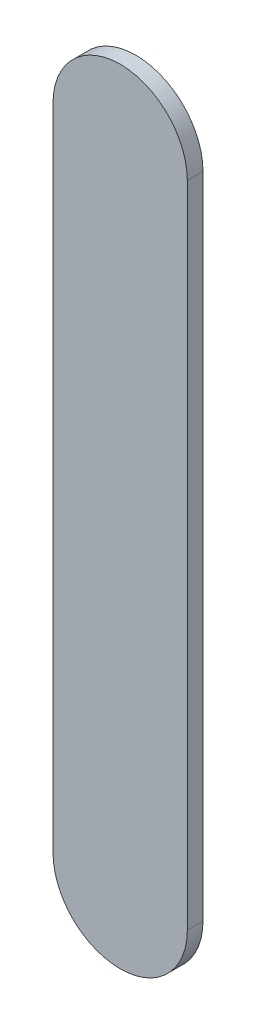
ISO-10303-21;
HEADER;
FILE_DESCRIPTION(('STEP AP214'),'2;1');
FILE_NAME('part.step','',(''),(''),'','','');
FILE_SCHEMA(('AUTOMOTIVE_DESIGN { 1 0 10303 214 1 1 1 1 }'));
ENDSEC;
DATA;
#1=APPLICATION_CONTEXT('core data for automotive mechanical design processes');
#2=APPLICATION_PROTOCOL_DEFINITION('international standard','automotive_design',2000,#1);
#3=PRODUCT_CONTEXT('',#1,'mechanical');
#4=PRODUCT('Part','Part','',(#3));
#5=PRODUCT_RELATED_PRODUCT_CATEGORY('part','',(#4));
#6=PRODUCT_DEFINITION_FORMATION('','',#4);
#7=PRODUCT_DEFINITION_CONTEXT('part definition',#1,'design');
#8=PRODUCT_DEFINITION('design','',#6,#7);
#9=PRODUCT_DEFINITION_SHAPE('','',#8);
#10=(LENGTH_UNIT() NAMED_UNIT(*) SI_UNIT(.MILLI.,.METRE.));
#11=(NAMED_UNIT(*) PLANE_ANGLE_UNIT() SI_UNIT($,.RADIAN.));
#12=(NAMED_UNIT(*) SI_UNIT($,.STERADIAN.) SOLID_ANGLE_UNIT());
#13=UNCERTAINTY_MEASURE_WITH_UNIT(LENGTH_MEASURE(1.E-05),#10,'distance_accuracy_value','');
#14=(GEOMETRIC_REPRESENTATION_CONTEXT(3) GLOBAL_UNCERTAINTY_ASSIGNED_CONTEXT((#13)) GLOBAL_UNIT_ASSIGNED_CONTEXT((#10,
#11,#12)) REPRESENTATION_CONTEXT('',''));
#15=CARTESIAN_POINT('',(0.,0.,0.));
#16=DIRECTION('',(0.,0.,1.));
#17=DIRECTION('',(1.,0.,0.));
#18=AXIS2_PLACEMENT_3D('',#15,#16,#17);
#19=CARTESIAN_POINT('',(131.448,-119.342,1.635));
#20=DIRECTION('',(0.,0.,1.));
#21=DIRECTION('',(1.,0.,0.));
#22=AXIS2_PLACEMENT_3D('',#19,#20,#21);
#23=PLANE('',#22);
#24=DIRECTION('',(0.,-1.,0.));
#25=VECTOR('',#24,1.);
#26=CARTESIAN_POINT('',(131.448,-119.342,1.635));
#27=LINE('',#26,#25);
#28=CARTESIAN_POINT('',(131.448,-119.342,1.635));
#29=VERTEX_POINT('',#28);
#30=CARTESIAN_POINT('',(131.448,-120.792,1.635));
#31=VERTEX_POINT('',#30);
#32=EDGE_CURVE('E79',#29,#31,#27,.T.);
#33=ORIENTED_EDGE('',*,*,#32,.T.);
#34=CARTESIAN_POINT('',(131.598,-120.792,1.635));
#35=DIRECTION('',(0.,0.,1.));
#36=DIRECTION('',(-1.,0.,0.));
#37=AXIS2_PLACEMENT_3D('',#34,#35,#36);
#38=CIRCLE('',#37,0.15);
#39=CARTESIAN_POINT('',(131.748,-120.792,1.635));
#40=VERTEX_POINT('',#39);
#41=EDGE_CURVE('E77',#31,#40,#38,.T.);
#42=ORIENTED_EDGE('',*,*,#41,.T.);
#43=DIRECTION('',(0.,1.,0.));
#44=VECTOR('',#43,1.);
#45=CARTESIAN_POINT('',(131.748,-120.792,1.635));
#46=LINE('',#45,#44);
#47=CARTESIAN_POINT('',(131.748,-119.342,1.635));
#48=VERTEX_POINT('',#47);
#49=EDGE_CURVE('E66',#40,#48,#46,.T.);
#50=ORIENTED_EDGE('',*,*,#49,.T.);
#51=CARTESIAN_POINT('',(131.598,-119.342,1.635));
#52=DIRECTION('',(0.,0.,1.));
#53=DIRECTION('',(1.,0.,0.));
#54=AXIS2_PLACEMENT_3D('',#51,#52,#53);
#55=CIRCLE('',#54,0.15);
#56=EDGE_CURVE('E11',#48,#29,#55,.T.);
#57=ORIENTED_EDGE('',*,*,#56,.T.);
#58=EDGE_LOOP('',(#33,#42,#50,#57));
#59=FACE_BOUND('',#58,.T.);
#60=ADVANCED_FACE('F17',(#59),#23,.T.);
#61=CARTESIAN_POINT('',(131.448,-119.342,1.6));
#62=DIRECTION('',(0.,0.,1.));
#63=DIRECTION('',(1.,0.,0.));
#64=AXIS2_PLACEMENT_3D('',#61,#62,#63);
#65=PLANE('',#64);
#66=CARTESIAN_POINT('',(131.598,-119.342,1.6));
#67=DIRECTION('',(0.,0.,1.));
#68=DIRECTION('',(1.,0.,0.));
#69=AXIS2_PLACEMENT_3D('',#66,#67,#68);
#70=CIRCLE('',#69,0.15);
#71=CARTESIAN_POINT('',(131.748,-119.342,1.6));
#72=VERTEX_POINT('',#71);
#73=CARTESIAN_POINT('',(131.448,-119.342,1.6));
#74=VERTEX_POINT('',#73);
#75=EDGE_CURVE('E28',#72,#74,#70,.T.);
#76=ORIENTED_EDGE('',*,*,#75,.F.);
#77=DIRECTION('',(0.,1.,0.));
#78=VECTOR('',#77,1.);
#79=CARTESIAN_POINT('',(131.748,-120.792,1.6));
#80=LINE('',#79,#78);
#81=CARTESIAN_POINT('',(131.748,-120.792,1.6));
#82=VERTEX_POINT('',#81);
#83=EDGE_CURVE('E84',#82,#72,#80,.T.);
#84=ORIENTED_EDGE('',*,*,#83,.F.);
#85=CARTESIAN_POINT('',(131.598,-120.792,1.6));
#86=DIRECTION('',(0.,0.,1.));
#87=DIRECTION('',(-1.,0.,0.));
#88=AXIS2_PLACEMENT_3D('',#85,#86,#87);
#89=CIRCLE('',#88,0.15);
#90=CARTESIAN_POINT('',(131.448,-120.792,1.6));
#91=VERTEX_POINT('',#90);
#92=EDGE_CURVE('E87',#91,#82,#89,.T.);
#93=ORIENTED_EDGE('',*,*,#92,.F.);
#94=DIRECTION('',(0.,-1.,0.));
#95=VECTOR('',#94,1.);
#96=CARTESIAN_POINT('',(131.448,-119.342,1.6));
#97=LINE('',#96,#95);
#98=EDGE_CURVE('E198',#74,#91,#97,.T.);
#99=ORIENTED_EDGE('',*,*,#98,.F.);
#100=EDGE_LOOP('',(#76,#84,#93,#99));
#101=FACE_BOUND('',#100,.T.);
#102=ADVANCED_FACE('F19',(#101),#65,.F.);
#103=CARTESIAN_POINT('',(131.598,-119.342,1.6));
#104=DIRECTION('',(0.,0.,-1.));
#105=DIRECTION('',(1.,0.,0.));
#106=AXIS2_PLACEMENT_3D('',#103,#104,#105);
#107=CYLINDRICAL_SURFACE('',#106,0.15);
#108=ORIENTED_EDGE('',*,*,#75,.T.);
#109=DIRECTION('',(0.,0.,1.));
#110=VECTOR('',#109,1.);
#111=CARTESIAN_POINT('',(131.448,-119.342,1.6));
#112=LINE('',#111,#110);
#113=EDGE_CURVE('E94',#74,#29,#112,.T.);
#114=ORIENTED_EDGE('',*,*,#113,.T.);
#115=ORIENTED_EDGE('',*,*,#56,.F.);
#116=DIRECTION('',(0.,0.,1.));
#117=VECTOR('',#116,1.);
#118=CARTESIAN_POINT('',(131.748,-119.342,1.6));
#119=LINE('',#118,#117);
#120=EDGE_CURVE('E21',#72,#48,#119,.T.);
#121=ORIENTED_EDGE('',*,*,#120,.F.);
#122=EDGE_LOOP('',(#108,#114,#115,#121));
#123=FACE_BOUND('',#122,.T.);
#124=ADVANCED_FACE('F150',(#123),#107,.T.);
#125=CARTESIAN_POINT('',(131.748,-120.792,1.6));
#126=DIRECTION('',(-1.,0.,0.));
#127=DIRECTION('',(0.,0.,1.));
#128=AXIS2_PLACEMENT_3D('',#125,#126,#127);
#129=PLANE('',#128);
#130=ORIENTED_EDGE('',*,*,#83,.T.);
#131=ORIENTED_EDGE('',*,*,#120,.T.);
#132=ORIENTED_EDGE('',*,*,#49,.F.);
#133=DIRECTION('',(0.,0.,1.));
#134=VECTOR('',#133,1.);
#135=CARTESIAN_POINT('',(131.748,-120.792,1.6));
#136=LINE('',#135,#134);
#137=EDGE_CURVE('E71',#82,#40,#136,.T.);
#138=ORIENTED_EDGE('',*,*,#137,.F.);
#139=EDGE_LOOP('',(#130,#131,#132,#138));
#140=FACE_BOUND('',#139,.T.);
#141=ADVANCED_FACE('F69',(#140),#129,.F.);
#142=CARTESIAN_POINT('',(131.598,-120.792,1.6));
#143=DIRECTION('',(0.,0.,-1.));
#144=DIRECTION('',(-1.,0.,0.));
#145=AXIS2_PLACEMENT_3D('',#142,#143,#144);
#146=CYLINDRICAL_SURFACE('',#145,0.15);
#147=ORIENTED_EDGE('',*,*,#92,.T.);
#148=ORIENTED_EDGE('',*,*,#137,.T.);
#149=ORIENTED_EDGE('',*,*,#41,.F.);
#150=DIRECTION('',(0.,0.,1.));
#151=VECTOR('',#150,1.);
#152=CARTESIAN_POINT('',(131.448,-120.792,1.6));
#153=LINE('',#152,#151);
#154=EDGE_CURVE('E98',#91,#31,#153,.T.);
#155=ORIENTED_EDGE('',*,*,#154,.F.);
#156=EDGE_LOOP('',(#147,#148,#149,#155));
#157=FACE_BOUND('',#156,.T.);
#158=ADVANCED_FACE('F86',(#157),#146,.T.);
#159=CARTESIAN_POINT('',(131.448,-119.342,1.6));
#160=DIRECTION('',(1.,0.,0.));
#161=DIRECTION('',(0.,1.,0.));
#162=AXIS2_PLACEMENT_3D('',#159,#160,#161);
#163=PLANE('',#162);
#164=ORIENTED_EDGE('',*,*,#98,.T.);
#165=ORIENTED_EDGE('',*,*,#154,.T.);
#166=ORIENTED_EDGE('',*,*,#32,.F.);
#167=ORIENTED_EDGE('',*,*,#113,.F.);
#168=EDGE_LOOP('',(#164,#165,#166,#167));
#169=FACE_BOUND('',#168,.T.);
#170=ADVANCED_FACE('F126',(#169),#163,.F.);
#171=CLOSED_SHELL('',(#60,#102,#124,#141,#158,#170));
#172=MANIFOLD_SOLID_BREP('B1',#171);
#173=ADVANCED_BREP_SHAPE_REPRESENTATION('',(#18,#172),#14);
#174=SHAPE_DEFINITION_REPRESENTATION(#9,#173);
ENDSEC;
END-ISO-10303-21;
